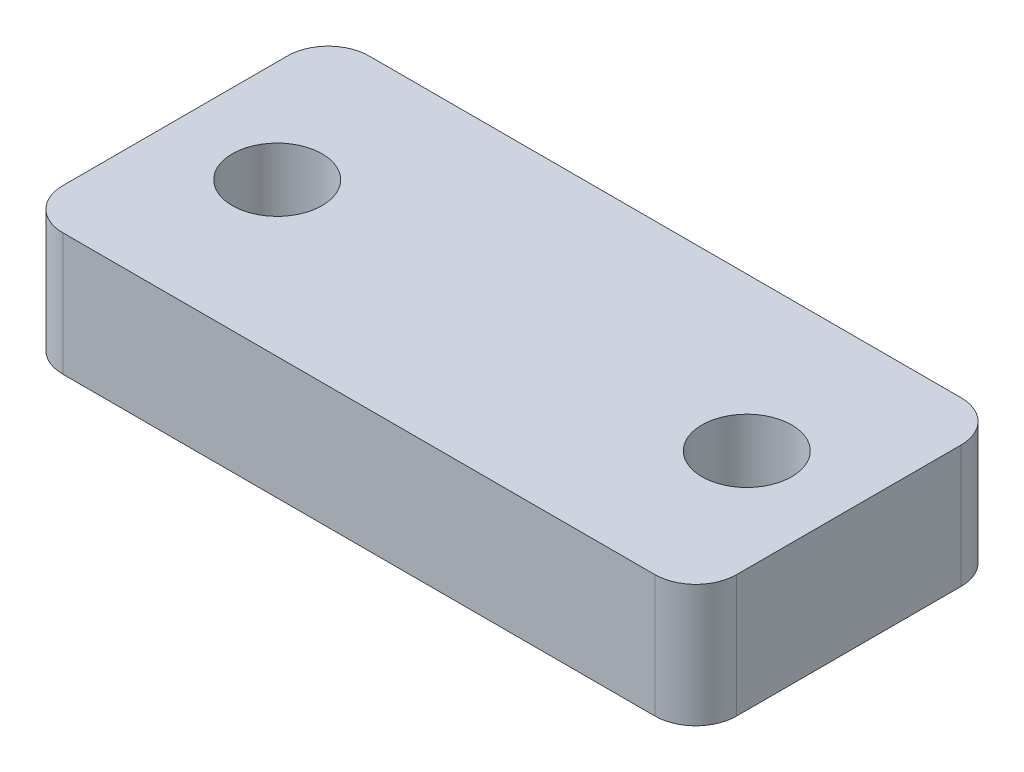
ISO-10303-21;
HEADER;
FILE_DESCRIPTION(('STEP AP214'),'2;1');
FILE_NAME('part.step','',(''),(''),'','','');
FILE_SCHEMA(('AUTOMOTIVE_DESIGN { 1 0 10303 214 1 1 1 1 }'));
ENDSEC;
DATA;
#1=APPLICATION_CONTEXT('core data for automotive mechanical design processes');
#2=APPLICATION_PROTOCOL_DEFINITION('international standard','automotive_design',2000,#1);
#3=PRODUCT_CONTEXT('',#1,'mechanical');
#4=PRODUCT('Part','Part','',(#3));
#5=PRODUCT_RELATED_PRODUCT_CATEGORY('part','',(#4));
#6=PRODUCT_DEFINITION_FORMATION('','',#4);
#7=PRODUCT_DEFINITION_CONTEXT('part definition',#1,'design');
#8=PRODUCT_DEFINITION('design','',#6,#7);
#9=PRODUCT_DEFINITION_SHAPE('','',#8);
#10=(LENGTH_UNIT() NAMED_UNIT(*) SI_UNIT(.MILLI.,.METRE.));
#11=(NAMED_UNIT(*) PLANE_ANGLE_UNIT() SI_UNIT($,.RADIAN.));
#12=(NAMED_UNIT(*) SI_UNIT($,.STERADIAN.) SOLID_ANGLE_UNIT());
#13=UNCERTAINTY_MEASURE_WITH_UNIT(LENGTH_MEASURE(1.E-05),#10,'distance_accuracy_value','');
#14=(GEOMETRIC_REPRESENTATION_CONTEXT(3) GLOBAL_UNCERTAINTY_ASSIGNED_CONTEXT((#13)) GLOBAL_UNIT_ASSIGNED_CONTEXT((#10,
#11,#12)) REPRESENTATION_CONTEXT('',''));
#15=CARTESIAN_POINT('',(0.,0.,0.));
#16=DIRECTION('',(0.,0.,1.));
#17=DIRECTION('',(1.,0.,0.));
#18=AXIS2_PLACEMENT_3D('',#15,#16,#17);
#19=CARTESIAN_POINT('',(0.,6.,0.));
#20=DIRECTION('',(0.,1.,0.));
#21=DIRECTION('',(0.,0.,1.));
#22=AXIS2_PLACEMENT_3D('',#19,#20,#21);
#23=PLANE('',#22);
#24=CARTESIAN_POINT('',(-11.5,6.,0.));
#25=DIRECTION('',(0.,1.,0.));
#26=DIRECTION('',(0.,0.,1.));
#27=AXIS2_PLACEMENT_3D('',#24,#25,#26);
#28=CIRCLE('',#27,2.2);
#29=CARTESIAN_POINT('',(-11.5,6.,2.2));
#30=VERTEX_POINT('',#29);
#31=EDGE_CURVE('E166',#30,#30,#28,.T.);
#32=ORIENTED_EDGE('',*,*,#31,.F.);
#33=EDGE_LOOP('',(#32));
#34=FACE_BOUND('',#33,.T.);
#35=DIRECTION('',(0.,0.,1.));
#36=VECTOR('',#35,1.);
#37=CARTESIAN_POINT('',(-16.5,6.,-7.5));
#38=LINE('',#37,#36);
#39=CARTESIAN_POINT('',(-16.5,6.,-5.5));
#40=VERTEX_POINT('',#39);
#41=CARTESIAN_POINT('',(-16.5,6.,5.5));
#42=VERTEX_POINT('',#41);
#43=EDGE_CURVE('E173',#40,#42,#38,.T.);
#44=ORIENTED_EDGE('',*,*,#43,.T.);
#45=CARTESIAN_POINT('',(-14.5,6.,5.5));
#46=DIRECTION('',(0.,1.,0.));
#47=DIRECTION('',(0.,0.,1.));
#48=AXIS2_PLACEMENT_3D('',#45,#46,#47);
#49=CIRCLE('',#48,2.);
#50=CARTESIAN_POINT('',(-14.5,6.,7.5));
#51=VERTEX_POINT('',#50);
#52=EDGE_CURVE('E150',#42,#51,#49,.T.);
#53=ORIENTED_EDGE('',*,*,#52,.T.);
#54=DIRECTION('',(1.,0.,0.));
#55=VECTOR('',#54,1.);
#56=CARTESIAN_POINT('',(-16.5,6.,7.5));
#57=LINE('',#56,#55);
#58=CARTESIAN_POINT('',(14.5,6.,7.5));
#59=VERTEX_POINT('',#58);
#60=EDGE_CURVE('E121',#51,#59,#57,.T.);
#61=ORIENTED_EDGE('',*,*,#60,.T.);
#62=CARTESIAN_POINT('',(14.5,6.,5.5));
#63=DIRECTION('',(0.,1.,0.));
#64=DIRECTION('',(0.,0.,1.));
#65=AXIS2_PLACEMENT_3D('',#62,#63,#64);
#66=CIRCLE('',#65,2.);
#67=CARTESIAN_POINT('',(16.5,6.,5.5));
#68=VERTEX_POINT('',#67);
#69=EDGE_CURVE('E145',#59,#68,#66,.T.);
#70=ORIENTED_EDGE('',*,*,#69,.T.);
#71=DIRECTION('',(0.,0.,-1.));
#72=VECTOR('',#71,1.);
#73=CARTESIAN_POINT('',(16.5,6.,-7.5));
#74=LINE('',#73,#72);
#75=CARTESIAN_POINT('',(16.5,6.,-5.5));
#76=VERTEX_POINT('',#75);
#77=EDGE_CURVE('E128',#68,#76,#74,.T.);
#78=ORIENTED_EDGE('',*,*,#77,.T.);
#79=CARTESIAN_POINT('',(14.5,6.,-5.5));
#80=DIRECTION('',(0.,1.,0.));
#81=DIRECTION('',(0.,0.,1.));
#82=AXIS2_PLACEMENT_3D('',#79,#80,#81);
#83=CIRCLE('',#82,2.);
#84=CARTESIAN_POINT('',(14.5,6.,-7.5));
#85=VERTEX_POINT('',#84);
#86=EDGE_CURVE('E57',#76,#85,#83,.T.);
#87=ORIENTED_EDGE('',*,*,#86,.T.);
#88=DIRECTION('',(-1.,0.,0.));
#89=VECTOR('',#88,1.);
#90=CARTESIAN_POINT('',(-16.5,6.,-7.5));
#91=LINE('',#90,#89);
#92=CARTESIAN_POINT('',(-14.5,6.,-7.5));
#93=VERTEX_POINT('',#92);
#94=EDGE_CURVE('E131',#85,#93,#91,.T.);
#95=ORIENTED_EDGE('',*,*,#94,.T.);
#96=CARTESIAN_POINT('',(-14.5,6.,-5.5));
#97=DIRECTION('',(0.,1.,0.));
#98=DIRECTION('',(0.,0.,1.));
#99=AXIS2_PLACEMENT_3D('',#96,#97,#98);
#100=CIRCLE('',#99,2.);
#101=EDGE_CURVE('E148',#93,#40,#100,.T.);
#102=ORIENTED_EDGE('',*,*,#101,.T.);
#103=EDGE_LOOP('',(#44,#53,#61,#70,#78,#87,#95,#102));
#104=FACE_BOUND('',#103,.T.);
#105=CARTESIAN_POINT('',(11.5,6.,0.));
#106=DIRECTION('',(0.,1.,0.));
#107=DIRECTION('',(0.,0.,-1.));
#108=AXIS2_PLACEMENT_3D('',#105,#106,#107);
#109=CIRCLE('',#108,2.2);
#110=CARTESIAN_POINT('',(11.5,6.,-2.2));
#111=VERTEX_POINT('',#110);
#112=EDGE_CURVE('E178',#111,#111,#109,.T.);
#113=ORIENTED_EDGE('',*,*,#112,.F.);
#114=EDGE_LOOP('',(#113));
#115=FACE_BOUND('',#114,.T.);
#116=ADVANCED_FACE('F35',(#34,#104,#115),#23,.T.);
#117=CARTESIAN_POINT('',(0.,0.,0.));
#118=DIRECTION('',(0.,1.,0.));
#119=DIRECTION('',(0.,0.,1.));
#120=AXIS2_PLACEMENT_3D('',#117,#118,#119);
#121=PLANE('',#120);
#122=DIRECTION('',(1.,0.,0.));
#123=VECTOR('',#122,1.);
#124=CARTESIAN_POINT('',(-16.5,0.,7.5));
#125=LINE('',#124,#123);
#126=CARTESIAN_POINT('',(-14.5,0.,7.5));
#127=VERTEX_POINT('',#126);
#128=CARTESIAN_POINT('',(14.5,0.,7.5));
#129=VERTEX_POINT('',#128);
#130=EDGE_CURVE('E118',#127,#129,#125,.T.);
#131=ORIENTED_EDGE('',*,*,#130,.F.);
#132=CARTESIAN_POINT('',(-14.5,0.,5.5));
#133=DIRECTION('',(0.,1.,0.));
#134=DIRECTION('',(0.,0.,1.));
#135=AXIS2_PLACEMENT_3D('',#132,#133,#134);
#136=CIRCLE('',#135,2.);
#137=CARTESIAN_POINT('',(-16.5,0.,5.5));
#138=VERTEX_POINT('',#137);
#139=EDGE_CURVE('E101',#127,#138,#136,.F.);
#140=ORIENTED_EDGE('',*,*,#139,.T.);
#141=DIRECTION('',(0.,0.,1.));
#142=VECTOR('',#141,1.);
#143=CARTESIAN_POINT('',(-16.5,0.,-7.5));
#144=LINE('',#143,#142);
#145=CARTESIAN_POINT('',(-16.5,0.,-5.5));
#146=VERTEX_POINT('',#145);
#147=EDGE_CURVE('E129',#146,#138,#144,.T.);
#148=ORIENTED_EDGE('',*,*,#147,.F.);
#149=CARTESIAN_POINT('',(-14.5,0.,-5.5));
#150=DIRECTION('',(0.,1.,0.));
#151=DIRECTION('',(0.,0.,1.));
#152=AXIS2_PLACEMENT_3D('',#149,#150,#151);
#153=CIRCLE('',#152,2.);
#154=CARTESIAN_POINT('',(-14.5,0.,-7.5));
#155=VERTEX_POINT('',#154);
#156=EDGE_CURVE('E112',#146,#155,#153,.F.);
#157=ORIENTED_EDGE('',*,*,#156,.T.);
#158=DIRECTION('',(-1.,0.,0.));
#159=VECTOR('',#158,1.);
#160=CARTESIAN_POINT('',(-16.5,0.,-7.5));
#161=LINE('',#160,#159);
#162=CARTESIAN_POINT('',(14.5,0.,-7.5));
#163=VERTEX_POINT('',#162);
#164=EDGE_CURVE('E133',#163,#155,#161,.T.);
#165=ORIENTED_EDGE('',*,*,#164,.F.);
#166=CARTESIAN_POINT('',(14.5,0.,-5.5));
#167=DIRECTION('',(0.,1.,0.));
#168=DIRECTION('',(0.,0.,1.));
#169=AXIS2_PLACEMENT_3D('',#166,#167,#168);
#170=CIRCLE('',#169,2.);
#171=CARTESIAN_POINT('',(16.5,0.,-5.5));
#172=VERTEX_POINT('',#171);
#173=EDGE_CURVE('E139',#163,#172,#170,.F.);
#174=ORIENTED_EDGE('',*,*,#173,.T.);
#175=DIRECTION('',(0.,0.,-1.));
#176=VECTOR('',#175,1.);
#177=CARTESIAN_POINT('',(16.5,0.,-7.5));
#178=LINE('',#177,#176);
#179=CARTESIAN_POINT('',(16.5,0.,5.5));
#180=VERTEX_POINT('',#179);
#181=EDGE_CURVE('E161',#180,#172,#178,.T.);
#182=ORIENTED_EDGE('',*,*,#181,.F.);
#183=CARTESIAN_POINT('',(14.5,0.,5.5));
#184=DIRECTION('',(0.,1.,0.));
#185=DIRECTION('',(0.,0.,1.));
#186=AXIS2_PLACEMENT_3D('',#183,#184,#185);
#187=CIRCLE('',#186,2.);
#188=EDGE_CURVE('E122',#180,#129,#187,.F.);
#189=ORIENTED_EDGE('',*,*,#188,.T.);
#190=EDGE_LOOP('',(#131,#140,#148,#157,#165,#174,#182,#189));
#191=FACE_BOUND('',#190,.T.);
#192=CARTESIAN_POINT('',(-11.5,0.,0.));
#193=DIRECTION('',(0.,1.,0.));
#194=DIRECTION('',(0.,0.,1.));
#195=AXIS2_PLACEMENT_3D('',#192,#193,#194);
#196=CIRCLE('',#195,2.2);
#197=CARTESIAN_POINT('',(-11.5,0.,2.2));
#198=VERTEX_POINT('',#197);
#199=EDGE_CURVE('E169',#198,#198,#196,.T.);
#200=ORIENTED_EDGE('',*,*,#199,.T.);
#201=EDGE_LOOP('',(#200));
#202=FACE_BOUND('',#201,.T.);
#203=CARTESIAN_POINT('',(11.5,0.,0.));
#204=DIRECTION('',(0.,1.,0.));
#205=DIRECTION('',(0.,0.,-1.));
#206=AXIS2_PLACEMENT_3D('',#203,#204,#205);
#207=CIRCLE('',#206,2.2);
#208=CARTESIAN_POINT('',(11.5,0.,-2.2));
#209=VERTEX_POINT('',#208);
#210=EDGE_CURVE('E180',#209,#209,#207,.T.);
#211=ORIENTED_EDGE('',*,*,#210,.T.);
#212=EDGE_LOOP('',(#211));
#213=FACE_BOUND('',#212,.T.);
#214=ADVANCED_FACE('F125',(#191,#202,#213),#121,.F.);
#215=CARTESIAN_POINT('',(16.5,6.,-7.5));
#216=DIRECTION('',(-1.,0.,0.));
#217=DIRECTION('',(0.,0.,1.));
#218=AXIS2_PLACEMENT_3D('',#215,#216,#217);
#219=PLANE('',#218);
#220=ORIENTED_EDGE('',*,*,#181,.T.);
#221=DIRECTION('',(0.,-1.,0.));
#222=VECTOR('',#221,1.);
#223=CARTESIAN_POINT('',(16.5,6.,-5.5));
#224=LINE('',#223,#222);
#225=EDGE_CURVE('E11',#172,#76,#224,.F.);
#226=ORIENTED_EDGE('',*,*,#225,.T.);
#227=ORIENTED_EDGE('',*,*,#77,.F.);
#228=DIRECTION('',(0.,-1.,0.));
#229=VECTOR('',#228,1.);
#230=CARTESIAN_POINT('',(16.5,6.,5.5));
#231=LINE('',#230,#229);
#232=EDGE_CURVE('E43',#68,#180,#231,.T.);
#233=ORIENTED_EDGE('',*,*,#232,.T.);
#234=EDGE_LOOP('',(#220,#226,#227,#233));
#235=FACE_BOUND('',#234,.T.);
#236=ADVANCED_FACE('F160',(#235),#219,.F.);
#237=CARTESIAN_POINT('',(-16.5,6.,-7.5));
#238=DIRECTION('',(0.,0.,1.));
#239=DIRECTION('',(1.,0.,0.));
#240=AXIS2_PLACEMENT_3D('',#237,#238,#239);
#241=PLANE('',#240);
#242=ORIENTED_EDGE('',*,*,#164,.T.);
#243=DIRECTION('',(0.,-1.,0.));
#244=VECTOR('',#243,1.);
#245=CARTESIAN_POINT('',(-14.5,6.,-7.5));
#246=LINE('',#245,#244);
#247=EDGE_CURVE('E50',#155,#93,#246,.F.);
#248=ORIENTED_EDGE('',*,*,#247,.T.);
#249=ORIENTED_EDGE('',*,*,#94,.F.);
#250=DIRECTION('',(0.,-1.,0.));
#251=VECTOR('',#250,1.);
#252=CARTESIAN_POINT('',(14.5,6.,-7.5));
#253=LINE('',#252,#251);
#254=EDGE_CURVE('E152',#85,#163,#253,.T.);
#255=ORIENTED_EDGE('',*,*,#254,.T.);
#256=EDGE_LOOP('',(#242,#248,#249,#255));
#257=FACE_BOUND('',#256,.T.);
#258=ADVANCED_FACE('F206',(#257),#241,.F.);
#259=CARTESIAN_POINT('',(-16.5,6.,-7.5));
#260=DIRECTION('',(1.,0.,0.));
#261=DIRECTION('',(0.,0.,-1.));
#262=AXIS2_PLACEMENT_3D('',#259,#260,#261);
#263=PLANE('',#262);
#264=ORIENTED_EDGE('',*,*,#147,.T.);
#265=DIRECTION('',(0.,-1.,0.));
#266=VECTOR('',#265,1.);
#267=CARTESIAN_POINT('',(-16.5,6.,5.5));
#268=LINE('',#267,#266);
#269=EDGE_CURVE('E106',#138,#42,#268,.F.);
#270=ORIENTED_EDGE('',*,*,#269,.T.);
#271=ORIENTED_EDGE('',*,*,#43,.F.);
#272=DIRECTION('',(0.,-1.,0.));
#273=VECTOR('',#272,1.);
#274=CARTESIAN_POINT('',(-16.5,6.,-5.5));
#275=LINE('',#274,#273);
#276=EDGE_CURVE('E111',#40,#146,#275,.T.);
#277=ORIENTED_EDGE('',*,*,#276,.T.);
#278=EDGE_LOOP('',(#264,#270,#271,#277));
#279=FACE_BOUND('',#278,.T.);
#280=ADVANCED_FACE('F203',(#279),#263,.F.);
#281=CARTESIAN_POINT('',(-16.5,6.,7.5));
#282=DIRECTION('',(0.,0.,-1.));
#283=DIRECTION('',(-1.,0.,0.));
#284=AXIS2_PLACEMENT_3D('',#281,#282,#283);
#285=PLANE('',#284);
#286=ORIENTED_EDGE('',*,*,#60,.F.);
#287=DIRECTION('',(0.,-1.,0.));
#288=VECTOR('',#287,1.);
#289=CARTESIAN_POINT('',(-14.5,6.,7.5));
#290=LINE('',#289,#288);
#291=EDGE_CURVE('E105',#51,#127,#290,.T.);
#292=ORIENTED_EDGE('',*,*,#291,.T.);
#293=ORIENTED_EDGE('',*,*,#130,.T.);
#294=DIRECTION('',(0.,-1.,0.));
#295=VECTOR('',#294,1.);
#296=CARTESIAN_POINT('',(14.5,6.,7.5));
#297=LINE('',#296,#295);
#298=EDGE_CURVE('E123',#129,#59,#297,.F.);
#299=ORIENTED_EDGE('',*,*,#298,.T.);
#300=EDGE_LOOP('',(#286,#292,#293,#299));
#301=FACE_BOUND('',#300,.T.);
#302=ADVANCED_FACE('F117',(#301),#285,.F.);
#303=CARTESIAN_POINT('',(-11.5,6.,0.));
#304=DIRECTION('',(0.,-1.,0.));
#305=DIRECTION('',(0.,0.,-1.));
#306=AXIS2_PLACEMENT_3D('',#303,#304,#305);
#307=CYLINDRICAL_SURFACE('',#306,2.2);
#308=ORIENTED_EDGE('',*,*,#31,.T.);
#309=EDGE_LOOP('',(#308));
#310=FACE_BOUND('',#309,.T.);
#311=ORIENTED_EDGE('',*,*,#199,.F.);
#312=EDGE_LOOP('',(#311));
#313=FACE_BOUND('',#312,.T.);
#314=ADVANCED_FACE('F198',(#310,#313),#307,.F.);
#315=CARTESIAN_POINT('',(11.5,6.,0.));
#316=DIRECTION('',(0.,-1.,0.));
#317=DIRECTION('',(0.,0.,-1.));
#318=AXIS2_PLACEMENT_3D('',#315,#316,#317);
#319=CYLINDRICAL_SURFACE('',#318,2.2);
#320=ORIENTED_EDGE('',*,*,#112,.T.);
#321=EDGE_LOOP('',(#320));
#322=FACE_BOUND('',#321,.T.);
#323=ORIENTED_EDGE('',*,*,#210,.F.);
#324=EDGE_LOOP('',(#323));
#325=FACE_BOUND('',#324,.T.);
#326=ADVANCED_FACE('F186',(#322,#325),#319,.F.);
#327=CARTESIAN_POINT('',(-14.5,6.,5.5));
#328=DIRECTION('',(0.,-1.,0.));
#329=DIRECTION('',(0.,0.,-1.));
#330=AXIS2_PLACEMENT_3D('',#327,#328,#329);
#331=CYLINDRICAL_SURFACE('',#330,2.);
#332=ORIENTED_EDGE('',*,*,#52,.F.);
#333=ORIENTED_EDGE('',*,*,#269,.F.);
#334=ORIENTED_EDGE('',*,*,#139,.F.);
#335=ORIENTED_EDGE('',*,*,#291,.F.);
#336=EDGE_LOOP('',(#332,#333,#334,#335));
#337=FACE_BOUND('',#336,.T.);
#338=ADVANCED_FACE('F104',(#337),#331,.T.);
#339=CARTESIAN_POINT('',(-14.5,6.,-5.5));
#340=DIRECTION('',(0.,-1.,0.));
#341=DIRECTION('',(0.,0.,-1.));
#342=AXIS2_PLACEMENT_3D('',#339,#340,#341);
#343=CYLINDRICAL_SURFACE('',#342,2.);
#344=ORIENTED_EDGE('',*,*,#101,.F.);
#345=ORIENTED_EDGE('',*,*,#247,.F.);
#346=ORIENTED_EDGE('',*,*,#156,.F.);
#347=ORIENTED_EDGE('',*,*,#276,.F.);
#348=EDGE_LOOP('',(#344,#345,#346,#347));
#349=FACE_BOUND('',#348,.T.);
#350=ADVANCED_FACE('F214',(#349),#343,.T.);
#351=CARTESIAN_POINT('',(14.5,6.,-5.5));
#352=DIRECTION('',(0.,-1.,0.));
#353=DIRECTION('',(0.,0.,-1.));
#354=AXIS2_PLACEMENT_3D('',#351,#352,#353);
#355=CYLINDRICAL_SURFACE('',#354,2.);
#356=ORIENTED_EDGE('',*,*,#86,.F.);
#357=ORIENTED_EDGE('',*,*,#225,.F.);
#358=ORIENTED_EDGE('',*,*,#173,.F.);
#359=ORIENTED_EDGE('',*,*,#254,.F.);
#360=EDGE_LOOP('',(#356,#357,#358,#359));
#361=FACE_BOUND('',#360,.T.);
#362=ADVANCED_FACE('F216',(#361),#355,.T.);
#363=CARTESIAN_POINT('',(14.5,6.,5.5));
#364=DIRECTION('',(0.,-1.,0.));
#365=DIRECTION('',(0.,0.,-1.));
#366=AXIS2_PLACEMENT_3D('',#363,#364,#365);
#367=CYLINDRICAL_SURFACE('',#366,2.);
#368=ORIENTED_EDGE('',*,*,#69,.F.);
#369=ORIENTED_EDGE('',*,*,#298,.F.);
#370=ORIENTED_EDGE('',*,*,#188,.F.);
#371=ORIENTED_EDGE('',*,*,#232,.F.);
#372=EDGE_LOOP('',(#368,#369,#370,#371));
#373=FACE_BOUND('',#372,.T.);
#374=ADVANCED_FACE('F37',(#373),#367,.T.);
#375=CLOSED_SHELL('',(#116,#214,#236,#258,#280,#302,#314,#326,#338,#350,#362,#374));
#376=MANIFOLD_SOLID_BREP('B2',#375);
#377=ADVANCED_BREP_SHAPE_REPRESENTATION('',(#18,#376),#14);
#378=SHAPE_DEFINITION_REPRESENTATION(#9,#377);
ENDSEC;
END-ISO-10303-21;
